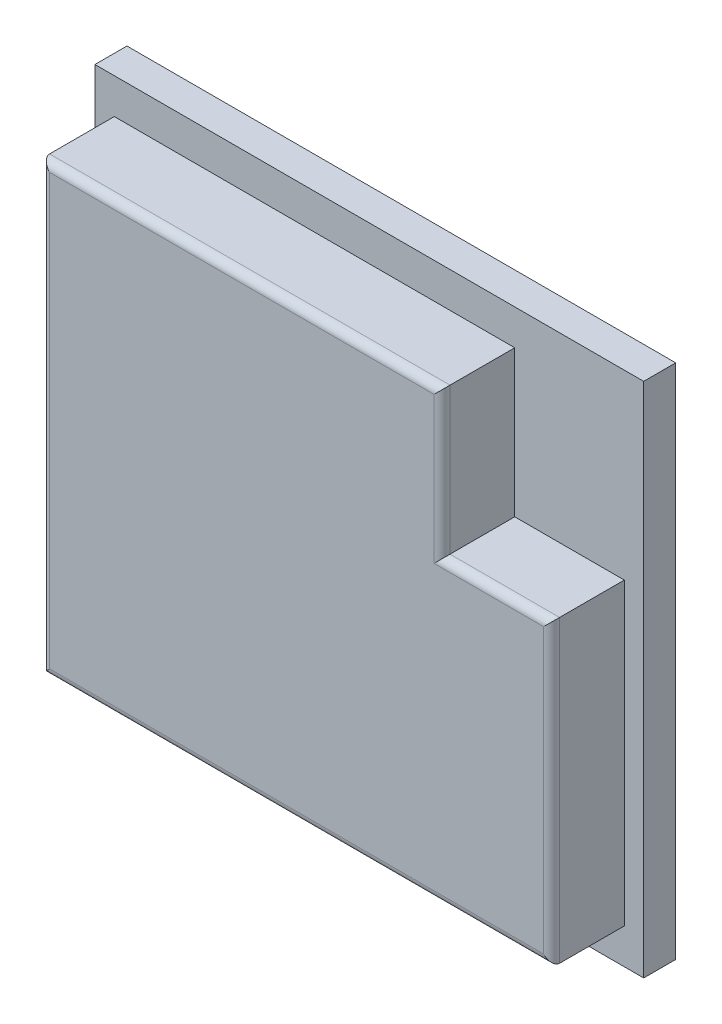
ISO-10303-21;
HEADER;
FILE_DESCRIPTION(('STEP AP214'),'2;1');
FILE_NAME('part.step','',(''),(''),'','','');
FILE_SCHEMA(('AUTOMOTIVE_DESIGN { 1 0 10303 214 1 1 1 1 }'));
ENDSEC;
DATA;
#1=APPLICATION_CONTEXT('core data for automotive mechanical design processes');
#2=APPLICATION_PROTOCOL_DEFINITION('international standard','automotive_design',2000,#1);
#3=PRODUCT_CONTEXT('',#1,'mechanical');
#4=PRODUCT('Part','Part','',(#3));
#5=PRODUCT_RELATED_PRODUCT_CATEGORY('part','',(#4));
#6=PRODUCT_DEFINITION_FORMATION('','',#4);
#7=PRODUCT_DEFINITION_CONTEXT('part definition',#1,'design');
#8=PRODUCT_DEFINITION('design','',#6,#7);
#9=PRODUCT_DEFINITION_SHAPE('','',#8);
#10=(LENGTH_UNIT() NAMED_UNIT(*) SI_UNIT(.MILLI.,.METRE.));
#11=(NAMED_UNIT(*) PLANE_ANGLE_UNIT() SI_UNIT($,.RADIAN.));
#12=(NAMED_UNIT(*) SI_UNIT($,.STERADIAN.) SOLID_ANGLE_UNIT());
#13=UNCERTAINTY_MEASURE_WITH_UNIT(LENGTH_MEASURE(1.E-05),#10,'distance_accuracy_value','');
#14=(GEOMETRIC_REPRESENTATION_CONTEXT(3) GLOBAL_UNCERTAINTY_ASSIGNED_CONTEXT((#13)) GLOBAL_UNIT_ASSIGNED_CONTEXT((#10,
#11,#12)) REPRESENTATION_CONTEXT('',''));
#15=CARTESIAN_POINT('',(0.,0.,0.));
#16=DIRECTION('',(0.,0.,1.));
#17=DIRECTION('',(1.,0.,0.));
#18=AXIS2_PLACEMENT_3D('',#15,#16,#17);
#19=CARTESIAN_POINT('',(0.,0.,1.));
#20=DIRECTION('',(0.,0.,-1.));
#21=DIRECTION('',(-1.,0.,0.));
#22=AXIS2_PLACEMENT_3D('',#19,#20,#21);
#23=PLANE('',#22);
#24=DIRECTION('',(0.,1.,0.));
#25=VECTOR('',#24,1.);
#26=CARTESIAN_POINT('',(8.565,-8.065,1.));
#27=LINE('',#26,#25);
#28=CARTESIAN_POINT('',(8.565,-8.065,1.));
#29=VERTEX_POINT('',#28);
#30=CARTESIAN_POINT('',(8.565,8.065,1.));
#31=VERTEX_POINT('',#30);
#32=EDGE_CURVE('E169',#29,#31,#27,.T.);
#33=ORIENTED_EDGE('',*,*,#32,.T.);
#34=DIRECTION('',(-1.,0.,0.));
#35=VECTOR('',#34,1.);
#36=CARTESIAN_POINT('',(-8.565,8.065,1.));
#37=LINE('',#36,#35);
#38=CARTESIAN_POINT('',(-8.565,8.065,1.));
#39=VERTEX_POINT('',#38);
#40=EDGE_CURVE('E172',#31,#39,#37,.T.);
#41=ORIENTED_EDGE('',*,*,#40,.T.);
#42=DIRECTION('',(0.,-1.,0.));
#43=VECTOR('',#42,1.);
#44=CARTESIAN_POINT('',(-8.565,-8.065,1.));
#45=LINE('',#44,#43);
#46=CARTESIAN_POINT('',(-8.565,-8.065,1.));
#47=VERTEX_POINT('',#46);
#48=EDGE_CURVE('E175',#39,#47,#45,.T.);
#49=ORIENTED_EDGE('',*,*,#48,.T.);
#50=DIRECTION('',(1.,0.,0.));
#51=VECTOR('',#50,1.);
#52=CARTESIAN_POINT('',(-8.565,-8.065,1.));
#53=LINE('',#52,#51);
#54=EDGE_CURVE('E177',#47,#29,#53,.T.);
#55=ORIENTED_EDGE('',*,*,#54,.T.);
#56=EDGE_LOOP('',(#33,#41,#49,#55));
#57=FACE_BOUND('',#56,.T.);
#58=DIRECTION('',(0.,-1.,0.));
#59=VECTOR('',#58,1.);
#60=CARTESIAN_POINT('',(-7.96,-6.96,1.));
#61=LINE('',#60,#59);
#62=CARTESIAN_POINT('',(-7.96,6.96,1.));
#63=VERTEX_POINT('',#62);
#64=CARTESIAN_POINT('',(-7.96,-6.96,1.));
#65=VERTEX_POINT('',#64);
#66=EDGE_CURVE('E133',#63,#65,#61,.T.);
#67=ORIENTED_EDGE('',*,*,#66,.F.);
#68=DIRECTION('',(-1.,0.,0.));
#69=VECTOR('',#68,1.);
#70=CARTESIAN_POINT('',(-7.96,6.96,1.));
#71=LINE('',#70,#69);
#72=CARTESIAN_POINT('',(4.54,6.96,1.));
#73=VERTEX_POINT('',#72);
#74=EDGE_CURVE('E140',#73,#63,#71,.T.);
#75=ORIENTED_EDGE('',*,*,#74,.F.);
#76=DIRECTION('',(0.,1.,0.));
#77=VECTOR('',#76,1.);
#78=CARTESIAN_POINT('',(4.54,6.96,1.));
#79=LINE('',#78,#77);
#80=CARTESIAN_POINT('',(4.54,2.39,1.));
#81=VERTEX_POINT('',#80);
#82=EDGE_CURVE('E153',#81,#73,#79,.T.);
#83=ORIENTED_EDGE('',*,*,#82,.F.);
#84=DIRECTION('',(-1.,0.,0.));
#85=VECTOR('',#84,1.);
#86=CARTESIAN_POINT('',(4.54,2.39,1.));
#87=LINE('',#86,#85);
#88=CARTESIAN_POINT('',(7.96,2.39,1.));
#89=VERTEX_POINT('',#88);
#90=EDGE_CURVE('E155',#89,#81,#87,.T.);
#91=ORIENTED_EDGE('',*,*,#90,.F.);
#92=DIRECTION('',(0.,1.,0.));
#93=VECTOR('',#92,1.);
#94=CARTESIAN_POINT('',(7.96,-6.96,1.));
#95=LINE('',#94,#93);
#96=CARTESIAN_POINT('',(7.96,-6.96,1.));
#97=VERTEX_POINT('',#96);
#98=EDGE_CURVE('E261',#97,#89,#95,.T.);
#99=ORIENTED_EDGE('',*,*,#98,.F.);
#100=DIRECTION('',(1.,0.,0.));
#101=VECTOR('',#100,1.);
#102=CARTESIAN_POINT('',(-7.96,-6.96,1.));
#103=LINE('',#102,#101);
#104=EDGE_CURVE('E149',#65,#97,#103,.T.);
#105=ORIENTED_EDGE('',*,*,#104,.F.);
#106=EDGE_LOOP('',(#67,#75,#83,#91,#99,#105));
#107=FACE_BOUND('',#106,.T.);
#108=ADVANCED_FACE('F34',(#57,#107),#23,.F.);
#109=CARTESIAN_POINT('',(8.565,-8.065,1.));
#110=DIRECTION('',(-1.,0.,0.));
#111=DIRECTION('',(0.,0.,1.));
#112=AXIS2_PLACEMENT_3D('',#109,#110,#111);
#113=PLANE('',#112);
#114=DIRECTION('',(0.,1.,0.));
#115=VECTOR('',#114,1.);
#116=CARTESIAN_POINT('',(8.565,-8.065,0.));
#117=LINE('',#116,#115);
#118=CARTESIAN_POINT('',(8.565,-8.065,0.));
#119=VERTEX_POINT('',#118);
#120=CARTESIAN_POINT('',(8.565,8.065,0.));
#121=VERTEX_POINT('',#120);
#122=EDGE_CURVE('E168',#119,#121,#117,.T.);
#123=ORIENTED_EDGE('',*,*,#122,.T.);
#124=DIRECTION('',(0.,0.,-1.));
#125=VECTOR('',#124,1.);
#126=CARTESIAN_POINT('',(8.565,8.065,1.));
#127=LINE('',#126,#125);
#128=EDGE_CURVE('E195',#31,#121,#127,.T.);
#129=ORIENTED_EDGE('',*,*,#128,.F.);
#130=ORIENTED_EDGE('',*,*,#32,.F.);
#131=DIRECTION('',(0.,0.,-1.));
#132=VECTOR('',#131,1.);
#133=CARTESIAN_POINT('',(8.565,-8.065,1.));
#134=LINE('',#133,#132);
#135=EDGE_CURVE('E179',#29,#119,#134,.T.);
#136=ORIENTED_EDGE('',*,*,#135,.T.);
#137=EDGE_LOOP('',(#123,#129,#130,#136));
#138=FACE_BOUND('',#137,.T.);
#139=ADVANCED_FACE('F275',(#138),#113,.F.);
#140=CARTESIAN_POINT('',(-8.565,8.065,1.));
#141=DIRECTION('',(0.,-1.,0.));
#142=DIRECTION('',(0.,0.,-1.));
#143=AXIS2_PLACEMENT_3D('',#140,#141,#142);
#144=PLANE('',#143);
#145=DIRECTION('',(-1.,0.,0.));
#146=VECTOR('',#145,1.);
#147=CARTESIAN_POINT('',(-8.565,8.065,0.));
#148=LINE('',#147,#146);
#149=CARTESIAN_POINT('',(-8.565,8.065,0.));
#150=VERTEX_POINT('',#149);
#151=EDGE_CURVE('E182',#121,#150,#148,.T.);
#152=ORIENTED_EDGE('',*,*,#151,.T.);
#153=DIRECTION('',(0.,0.,-1.));
#154=VECTOR('',#153,1.);
#155=CARTESIAN_POINT('',(-8.565,8.065,1.));
#156=LINE('',#155,#154);
#157=EDGE_CURVE('E192',#39,#150,#156,.T.);
#158=ORIENTED_EDGE('',*,*,#157,.F.);
#159=ORIENTED_EDGE('',*,*,#40,.F.);
#160=ORIENTED_EDGE('',*,*,#128,.T.);
#161=EDGE_LOOP('',(#152,#158,#159,#160));
#162=FACE_BOUND('',#161,.T.);
#163=ADVANCED_FACE('F281',(#162),#144,.F.);
#164=CARTESIAN_POINT('',(-8.565,-8.065,1.));
#165=DIRECTION('',(1.,0.,0.));
#166=DIRECTION('',(0.,0.,-1.));
#167=AXIS2_PLACEMENT_3D('',#164,#165,#166);
#168=PLANE('',#167);
#169=DIRECTION('',(0.,-1.,0.));
#170=VECTOR('',#169,1.);
#171=CARTESIAN_POINT('',(-8.565,-8.065,0.));
#172=LINE('',#171,#170);
#173=CARTESIAN_POINT('',(-8.565,-8.065,0.));
#174=VERTEX_POINT('',#173);
#175=EDGE_CURVE('E184',#150,#174,#172,.T.);
#176=ORIENTED_EDGE('',*,*,#175,.T.);
#177=DIRECTION('',(0.,0.,-1.));
#178=VECTOR('',#177,1.);
#179=CARTESIAN_POINT('',(-8.565,-8.065,1.));
#180=LINE('',#179,#178);
#181=EDGE_CURVE('E189',#47,#174,#180,.T.);
#182=ORIENTED_EDGE('',*,*,#181,.F.);
#183=ORIENTED_EDGE('',*,*,#48,.F.);
#184=ORIENTED_EDGE('',*,*,#157,.T.);
#185=EDGE_LOOP('',(#176,#182,#183,#184));
#186=FACE_BOUND('',#185,.T.);
#187=ADVANCED_FACE('F293',(#186),#168,.F.);
#188=CARTESIAN_POINT('',(-8.565,-8.065,1.));
#189=DIRECTION('',(0.,1.,0.));
#190=DIRECTION('',(0.,0.,1.));
#191=AXIS2_PLACEMENT_3D('',#188,#189,#190);
#192=PLANE('',#191);
#193=DIRECTION('',(1.,0.,0.));
#194=VECTOR('',#193,1.);
#195=CARTESIAN_POINT('',(-8.565,-8.065,0.));
#196=LINE('',#195,#194);
#197=EDGE_CURVE('E173',#174,#119,#196,.T.);
#198=ORIENTED_EDGE('',*,*,#197,.T.);
#199=ORIENTED_EDGE('',*,*,#135,.F.);
#200=ORIENTED_EDGE('',*,*,#54,.F.);
#201=ORIENTED_EDGE('',*,*,#181,.T.);
#202=EDGE_LOOP('',(#198,#199,#200,#201));
#203=FACE_BOUND('',#202,.T.);
#204=ADVANCED_FACE('F289',(#203),#192,.F.);
#205=CARTESIAN_POINT('',(0.,0.,0.));
#206=DIRECTION('',(0.,0.,-1.));
#207=DIRECTION('',(-1.,0.,0.));
#208=AXIS2_PLACEMENT_3D('',#205,#206,#207);
#209=PLANE('',#208);
#210=ORIENTED_EDGE('',*,*,#122,.F.);
#211=ORIENTED_EDGE('',*,*,#197,.F.);
#212=ORIENTED_EDGE('',*,*,#175,.F.);
#213=ORIENTED_EDGE('',*,*,#151,.F.);
#214=EDGE_LOOP('',(#210,#211,#212,#213));
#215=FACE_BOUND('',#214,.T.);
#216=ADVANCED_FACE('F286',(#215),#209,.T.);
#217=CARTESIAN_POINT('',(-7.96,-6.96,3.27));
#218=DIRECTION('',(1.,0.,0.));
#219=DIRECTION('',(0.,0.,-1.));
#220=AXIS2_PLACEMENT_3D('',#217,#218,#219);
#221=PLANE('',#220);
#222=DIRECTION('',(0.,0.,-1.));
#223=VECTOR('',#222,1.);
#224=CARTESIAN_POINT('',(-7.96,-6.96,3.27));
#225=LINE('',#224,#223);
#226=CARTESIAN_POINT('',(-7.96,-6.96,3.02));
#227=VERTEX_POINT('',#226);
#228=EDGE_CURVE('E166',#227,#65,#225,.T.);
#229=ORIENTED_EDGE('',*,*,#228,.F.);
#230=DIRECTION('',(0.,-1.,0.));
#231=VECTOR('',#230,1.);
#232=CARTESIAN_POINT('',(-7.96,-6.96,3.02));
#233=LINE('',#232,#231);
#234=CARTESIAN_POINT('',(-7.96,6.96,3.02));
#235=VERTEX_POINT('',#234);
#236=EDGE_CURVE('E11',#227,#235,#233,.F.);
#237=ORIENTED_EDGE('',*,*,#236,.T.);
#238=DIRECTION('',(0.,0.,-1.));
#239=VECTOR('',#238,1.);
#240=CARTESIAN_POINT('',(-7.96,6.96,3.27));
#241=LINE('',#240,#239);
#242=EDGE_CURVE('E130',#235,#63,#241,.T.);
#243=ORIENTED_EDGE('',*,*,#242,.T.);
#244=ORIENTED_EDGE('',*,*,#66,.T.);
#245=EDGE_LOOP('',(#229,#237,#243,#244));
#246=FACE_BOUND('',#245,.T.);
#247=ADVANCED_FACE('F132',(#246),#221,.F.);
#248=CARTESIAN_POINT('',(-7.96,-6.96,3.27));
#249=DIRECTION('',(0.,1.,0.));
#250=DIRECTION('',(0.,0.,1.));
#251=AXIS2_PLACEMENT_3D('',#248,#249,#250);
#252=PLANE('',#251);
#253=DIRECTION('',(0.,0.,-1.));
#254=VECTOR('',#253,1.);
#255=CARTESIAN_POINT('',(7.96,-6.96,3.27));
#256=LINE('',#255,#254);
#257=CARTESIAN_POINT('',(7.96,-6.96,3.02));
#258=VERTEX_POINT('',#257);
#259=EDGE_CURVE('E164',#258,#97,#256,.T.);
#260=ORIENTED_EDGE('',*,*,#259,.F.);
#261=DIRECTION('',(1.,0.,0.));
#262=VECTOR('',#261,1.);
#263=CARTESIAN_POINT('',(-7.96,-6.96,3.02));
#264=LINE('',#263,#262);
#265=EDGE_CURVE('E43',#258,#227,#264,.F.);
#266=ORIENTED_EDGE('',*,*,#265,.T.);
#267=ORIENTED_EDGE('',*,*,#228,.T.);
#268=ORIENTED_EDGE('',*,*,#104,.T.);
#269=EDGE_LOOP('',(#260,#266,#267,#268));
#270=FACE_BOUND('',#269,.T.);
#271=ADVANCED_FACE('F264',(#270),#252,.F.);
#272=CARTESIAN_POINT('',(7.96,-6.96,3.27));
#273=DIRECTION('',(-1.,0.,0.));
#274=DIRECTION('',(0.,0.,1.));
#275=AXIS2_PLACEMENT_3D('',#272,#273,#274);
#276=PLANE('',#275);
#277=DIRECTION('',(0.,0.,-1.));
#278=VECTOR('',#277,1.);
#279=CARTESIAN_POINT('',(7.96,2.39,3.27));
#280=LINE('',#279,#278);
#281=CARTESIAN_POINT('',(7.96,2.39,3.02));
#282=VERTEX_POINT('',#281);
#283=EDGE_CURVE('E162',#282,#89,#280,.T.);
#284=ORIENTED_EDGE('',*,*,#283,.F.);
#285=DIRECTION('',(0.,1.,0.));
#286=VECTOR('',#285,1.);
#287=CARTESIAN_POINT('',(7.96,-6.96,3.02));
#288=LINE('',#287,#286);
#289=EDGE_CURVE('E58',#282,#258,#288,.F.);
#290=ORIENTED_EDGE('',*,*,#289,.T.);
#291=ORIENTED_EDGE('',*,*,#259,.T.);
#292=ORIENTED_EDGE('',*,*,#98,.T.);
#293=EDGE_LOOP('',(#284,#290,#291,#292));
#294=FACE_BOUND('',#293,.T.);
#295=ADVANCED_FACE('F265',(#294),#276,.F.);
#296=CARTESIAN_POINT('',(4.54,2.39,3.27));
#297=DIRECTION('',(0.,-1.,0.));
#298=DIRECTION('',(0.,0.,-1.));
#299=AXIS2_PLACEMENT_3D('',#296,#297,#298);
#300=PLANE('',#299);
#301=DIRECTION('',(0.,0.,-1.));
#302=VECTOR('',#301,1.);
#303=CARTESIAN_POINT('',(4.54,2.39,3.27));
#304=LINE('',#303,#302);
#305=CARTESIAN_POINT('',(4.54,2.39,3.02));
#306=VERTEX_POINT('',#305);
#307=EDGE_CURVE('E160',#306,#81,#304,.T.);
#308=ORIENTED_EDGE('',*,*,#307,.F.);
#309=DIRECTION('',(-1.,0.,0.));
#310=VECTOR('',#309,1.);
#311=CARTESIAN_POINT('',(4.54,2.39,3.02));
#312=LINE('',#311,#310);
#313=EDGE_CURVE('E215',#306,#282,#312,.F.);
#314=ORIENTED_EDGE('',*,*,#313,.T.);
#315=ORIENTED_EDGE('',*,*,#283,.T.);
#316=ORIENTED_EDGE('',*,*,#90,.T.);
#317=EDGE_LOOP('',(#308,#314,#315,#316));
#318=FACE_BOUND('',#317,.T.);
#319=ADVANCED_FACE('F260',(#318),#300,.F.);
#320=CARTESIAN_POINT('',(4.54,6.96,3.27));
#321=DIRECTION('',(-1.,0.,0.));
#322=DIRECTION('',(0.,-1.,0.));
#323=AXIS2_PLACEMENT_3D('',#320,#321,#322);
#324=PLANE('',#323);
#325=DIRECTION('',(0.,0.,-1.));
#326=VECTOR('',#325,1.);
#327=CARTESIAN_POINT('',(4.54,6.96,3.27));
#328=LINE('',#327,#326);
#329=CARTESIAN_POINT('',(4.54,6.96,3.02));
#330=VERTEX_POINT('',#329);
#331=EDGE_CURVE('E139',#330,#73,#328,.T.);
#332=ORIENTED_EDGE('',*,*,#331,.F.);
#333=DIRECTION('',(0.,1.,0.));
#334=VECTOR('',#333,1.);
#335=CARTESIAN_POINT('',(4.54,6.96,3.02));
#336=LINE('',#335,#334);
#337=EDGE_CURVE('E213',#330,#306,#336,.F.);
#338=ORIENTED_EDGE('',*,*,#337,.T.);
#339=ORIENTED_EDGE('',*,*,#307,.T.);
#340=ORIENTED_EDGE('',*,*,#82,.T.);
#341=EDGE_LOOP('',(#332,#338,#339,#340));
#342=FACE_BOUND('',#341,.T.);
#343=ADVANCED_FACE('F254',(#342),#324,.F.);
#344=CARTESIAN_POINT('',(-7.96,6.96,3.27));
#345=DIRECTION('',(0.,-1.,0.));
#346=DIRECTION('',(0.,0.,-1.));
#347=AXIS2_PLACEMENT_3D('',#344,#345,#346);
#348=PLANE('',#347);
#349=ORIENTED_EDGE('',*,*,#242,.F.);
#350=DIRECTION('',(-1.,0.,0.));
#351=VECTOR('',#350,1.);
#352=CARTESIAN_POINT('',(-7.96,6.96,3.02));
#353=LINE('',#352,#351);
#354=EDGE_CURVE('E211',#235,#330,#353,.F.);
#355=ORIENTED_EDGE('',*,*,#354,.T.);
#356=ORIENTED_EDGE('',*,*,#331,.T.);
#357=ORIENTED_EDGE('',*,*,#74,.T.);
#358=EDGE_LOOP('',(#349,#355,#356,#357));
#359=FACE_BOUND('',#358,.T.);
#360=ADVANCED_FACE('F151',(#359),#348,.F.);
#361=CARTESIAN_POINT('',(0.,0.,3.27));
#362=DIRECTION('',(0.,0.,-1.));
#363=DIRECTION('',(-1.,0.,0.));
#364=AXIS2_PLACEMENT_3D('',#361,#362,#363);
#365=PLANE('',#364);
#366=DIRECTION('',(0.,1.,0.));
#367=VECTOR('',#366,1.);
#368=CARTESIAN_POINT('',(4.29,0.,3.27));
#369=LINE('',#368,#367);
#370=CARTESIAN_POINT('',(4.29,2.14,3.27));
#371=VERTEX_POINT('',#370);
#372=CARTESIAN_POINT('',(4.29,6.71,3.27));
#373=VERTEX_POINT('',#372);
#374=EDGE_CURVE('E206',#371,#373,#369,.T.);
#375=ORIENTED_EDGE('',*,*,#374,.T.);
#376=DIRECTION('',(-1.,0.,0.));
#377=VECTOR('',#376,1.);
#378=CARTESIAN_POINT('',(0.,6.71,3.27));
#379=LINE('',#378,#377);
#380=CARTESIAN_POINT('',(-7.71,6.71,3.27));
#381=VERTEX_POINT('',#380);
#382=EDGE_CURVE('E208',#373,#381,#379,.T.);
#383=ORIENTED_EDGE('',*,*,#382,.T.);
#384=DIRECTION('',(0.,-1.,0.));
#385=VECTOR('',#384,1.);
#386=CARTESIAN_POINT('',(-7.71,0.,3.27));
#387=LINE('',#386,#385);
#388=CARTESIAN_POINT('',(-7.71,-6.71,3.27));
#389=VERTEX_POINT('',#388);
#390=EDGE_CURVE('E198',#381,#389,#387,.T.);
#391=ORIENTED_EDGE('',*,*,#390,.T.);
#392=DIRECTION('',(1.,0.,0.));
#393=VECTOR('',#392,1.);
#394=CARTESIAN_POINT('',(0.,-6.71,3.27));
#395=LINE('',#394,#393);
#396=CARTESIAN_POINT('',(7.71,-6.71,3.27));
#397=VERTEX_POINT('',#396);
#398=EDGE_CURVE('E200',#389,#397,#395,.T.);
#399=ORIENTED_EDGE('',*,*,#398,.T.);
#400=DIRECTION('',(0.,1.,0.));
#401=VECTOR('',#400,1.);
#402=CARTESIAN_POINT('',(7.71,0.,3.27));
#403=LINE('',#402,#401);
#404=CARTESIAN_POINT('',(7.71,2.14,3.27));
#405=VERTEX_POINT('',#404);
#406=EDGE_CURVE('E202',#397,#405,#403,.T.);
#407=ORIENTED_EDGE('',*,*,#406,.T.);
#408=DIRECTION('',(-1.,0.,0.));
#409=VECTOR('',#408,1.);
#410=CARTESIAN_POINT('',(0.,2.14,3.27));
#411=LINE('',#410,#409);
#412=EDGE_CURVE('E204',#405,#371,#411,.T.);
#413=ORIENTED_EDGE('',*,*,#412,.T.);
#414=EDGE_LOOP('',(#375,#383,#391,#399,#407,#413));
#415=FACE_BOUND('',#414,.T.);
#416=ADVANCED_FACE('F314',(#415),#365,.F.);
#417=CARTESIAN_POINT('',(7.71,0.,3.02));
#418=DIRECTION('',(0.,1.,0.));
#419=DIRECTION('',(0.,0.,1.));
#420=AXIS2_PLACEMENT_3D('',#417,#418,#419);
#421=CYLINDRICAL_SURFACE('',#420,0.25);
#422=CARTESIAN_POINT('',(7.71,-6.71,3.02));
#423=DIRECTION('',(0.707106781186547,0.707106781186547,0.));
#424=DIRECTION('',(0.707106781186547,-0.707106781186547,0.));
#425=AXIS2_PLACEMENT_3D('',#422,#423,#424);
#426=ELLIPSE('',#425,0.353553390593274,0.25);
#427=EDGE_CURVE('E228',#258,#397,#426,.F.);
#428=ORIENTED_EDGE('',*,*,#427,.F.);
#429=ORIENTED_EDGE('',*,*,#289,.F.);
#430=CARTESIAN_POINT('',(7.71,2.14,3.02));
#431=DIRECTION('',(-0.707106781186547,0.707106781186547,0.));
#432=DIRECTION('',(0.707106781186547,0.707106781186547,0.));
#433=AXIS2_PLACEMENT_3D('',#430,#431,#432);
#434=ELLIPSE('',#433,0.353553390593274,0.25);
#435=EDGE_CURVE('E38',#405,#282,#434,.T.);
#436=ORIENTED_EDGE('',*,*,#435,.F.);
#437=ORIENTED_EDGE('',*,*,#406,.F.);
#438=EDGE_LOOP('',(#428,#429,#436,#437));
#439=FACE_BOUND('',#438,.T.);
#440=ADVANCED_FACE('F36',(#439),#421,.T.);
#441=CARTESIAN_POINT('',(0.,2.14,3.02));
#442=DIRECTION('',(-1.,0.,0.));
#443=DIRECTION('',(0.,0.,1.));
#444=AXIS2_PLACEMENT_3D('',#441,#442,#443);
#445=CYLINDRICAL_SURFACE('',#444,0.25);
#446=ORIENTED_EDGE('',*,*,#435,.T.);
#447=ORIENTED_EDGE('',*,*,#313,.F.);
#448=CARTESIAN_POINT('',(4.29,2.14,3.02));
#449=DIRECTION('',(-0.707106781186548,0.707106781186547,0.));
#450=DIRECTION('',(0.707106781186547,0.707106781186548,0.));
#451=AXIS2_PLACEMENT_3D('',#448,#449,#450);
#452=ELLIPSE('',#451,0.353553390593274,0.25);
#453=EDGE_CURVE('E226',#371,#306,#452,.T.);
#454=ORIENTED_EDGE('',*,*,#453,.F.);
#455=ORIENTED_EDGE('',*,*,#412,.F.);
#456=EDGE_LOOP('',(#446,#447,#454,#455));
#457=FACE_BOUND('',#456,.T.);
#458=ADVANCED_FACE('F238',(#457),#445,.T.);
#459=CARTESIAN_POINT('',(0.,-6.71,3.02));
#460=DIRECTION('',(1.,0.,0.));
#461=DIRECTION('',(0.,0.,-1.));
#462=AXIS2_PLACEMENT_3D('',#459,#460,#461);
#463=CYLINDRICAL_SURFACE('',#462,0.25);
#464=ORIENTED_EDGE('',*,*,#427,.T.);
#465=ORIENTED_EDGE('',*,*,#398,.F.);
#466=CARTESIAN_POINT('',(-7.71,-6.71,3.02));
#467=DIRECTION('',(0.707106781186547,-0.707106781186547,0.));
#468=DIRECTION('',(-0.707106781186547,-0.707106781186547,0.));
#469=AXIS2_PLACEMENT_3D('',#466,#467,#468);
#470=ELLIPSE('',#469,0.353553390593274,0.25);
#471=EDGE_CURVE('E223',#227,#389,#470,.F.);
#472=ORIENTED_EDGE('',*,*,#471,.F.);
#473=ORIENTED_EDGE('',*,*,#265,.F.);
#474=EDGE_LOOP('',(#464,#465,#472,#473));
#475=FACE_BOUND('',#474,.T.);
#476=ADVANCED_FACE('F243',(#475),#463,.T.);
#477=CARTESIAN_POINT('',(4.29,0.,3.02));
#478=DIRECTION('',(0.,1.,0.));
#479=DIRECTION('',(-1.,0.,0.));
#480=AXIS2_PLACEMENT_3D('',#477,#478,#479);
#481=CYLINDRICAL_SURFACE('',#480,0.25);
#482=ORIENTED_EDGE('',*,*,#453,.T.);
#483=ORIENTED_EDGE('',*,*,#337,.F.);
#484=CARTESIAN_POINT('',(4.29,6.71,3.02));
#485=DIRECTION('',(-0.707106781186548,0.707106781186547,0.));
#486=DIRECTION('',(0.707106781186547,0.707106781186548,0.));
#487=AXIS2_PLACEMENT_3D('',#484,#485,#486);
#488=ELLIPSE('',#487,0.353553390593274,0.25);
#489=EDGE_CURVE('E221',#373,#330,#488,.T.);
#490=ORIENTED_EDGE('',*,*,#489,.F.);
#491=ORIENTED_EDGE('',*,*,#374,.F.);
#492=EDGE_LOOP('',(#482,#483,#490,#491));
#493=FACE_BOUND('',#492,.T.);
#494=ADVANCED_FACE('F305',(#493),#481,.T.);
#495=CARTESIAN_POINT('',(-7.71,0.,3.02));
#496=DIRECTION('',(0.,-1.,0.));
#497=DIRECTION('',(0.,0.,-1.));
#498=AXIS2_PLACEMENT_3D('',#495,#496,#497);
#499=CYLINDRICAL_SURFACE('',#498,0.25);
#500=ORIENTED_EDGE('',*,*,#471,.T.);
#501=ORIENTED_EDGE('',*,*,#390,.F.);
#502=CARTESIAN_POINT('',(-7.71,6.71,3.02));
#503=DIRECTION('',(-0.707106781186547,-0.707106781186547,0.));
#504=DIRECTION('',(0.707106781186547,-0.707106781186547,0.));
#505=AXIS2_PLACEMENT_3D('',#502,#503,#504);
#506=ELLIPSE('',#505,0.353553390593274,0.25);
#507=EDGE_CURVE('E219',#235,#381,#506,.F.);
#508=ORIENTED_EDGE('',*,*,#507,.F.);
#509=ORIENTED_EDGE('',*,*,#236,.F.);
#510=EDGE_LOOP('',(#500,#501,#508,#509));
#511=FACE_BOUND('',#510,.T.);
#512=ADVANCED_FACE('F247',(#511),#499,.T.);
#513=CARTESIAN_POINT('',(0.,6.71,3.02));
#514=DIRECTION('',(-1.,0.,0.));
#515=DIRECTION('',(0.,0.,1.));
#516=AXIS2_PLACEMENT_3D('',#513,#514,#515);
#517=CYLINDRICAL_SURFACE('',#516,0.25);
#518=ORIENTED_EDGE('',*,*,#489,.T.);
#519=ORIENTED_EDGE('',*,*,#354,.F.);
#520=ORIENTED_EDGE('',*,*,#507,.T.);
#521=ORIENTED_EDGE('',*,*,#382,.F.);
#522=EDGE_LOOP('',(#518,#519,#520,#521));
#523=FACE_BOUND('',#522,.T.);
#524=ADVANCED_FACE('F250',(#523),#517,.T.);
#525=CLOSED_SHELL('',(#108,#139,#163,#187,#204,#216,#247,#271,#295,#319,#343,#360,#416,#440,
#458,#476,#494,#512,#524));
#526=MANIFOLD_SOLID_BREP('B2',#525);
#527=ADVANCED_BREP_SHAPE_REPRESENTATION('',(#18,#526),#14);
#528=SHAPE_DEFINITION_REPRESENTATION(#9,#527);
ENDSEC;
END-ISO-10303-21;
